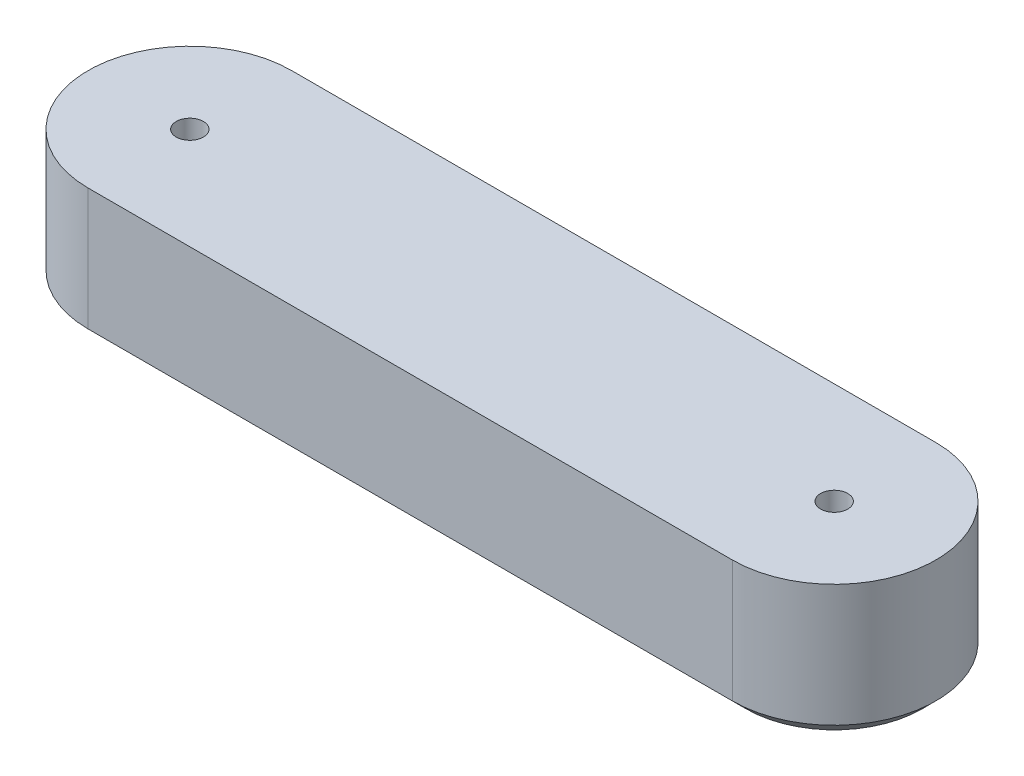
ISO-10303-21;
HEADER;
FILE_DESCRIPTION(('STEP AP214'),'2;1');
FILE_NAME('part.step','',(''),(''),'','','');
FILE_SCHEMA(('AUTOMOTIVE_DESIGN { 1 0 10303 214 1 1 1 1 }'));
ENDSEC;
DATA;
#1=APPLICATION_CONTEXT('core data for automotive mechanical design processes');
#2=APPLICATION_PROTOCOL_DEFINITION('international standard','automotive_design',2000,#1);
#3=PRODUCT_CONTEXT('',#1,'mechanical');
#4=PRODUCT('Part','Part','',(#3));
#5=PRODUCT_RELATED_PRODUCT_CATEGORY('part','',(#4));
#6=PRODUCT_DEFINITION_FORMATION('','',#4);
#7=PRODUCT_DEFINITION_CONTEXT('part definition',#1,'design');
#8=PRODUCT_DEFINITION('design','',#6,#7);
#9=PRODUCT_DEFINITION_SHAPE('','',#8);
#10=(LENGTH_UNIT() NAMED_UNIT(*) SI_UNIT(.MILLI.,.METRE.));
#11=(NAMED_UNIT(*) PLANE_ANGLE_UNIT() SI_UNIT($,.RADIAN.));
#12=(NAMED_UNIT(*) SI_UNIT($,.STERADIAN.) SOLID_ANGLE_UNIT());
#13=UNCERTAINTY_MEASURE_WITH_UNIT(LENGTH_MEASURE(1.E-05),#10,'distance_accuracy_value','');
#14=(GEOMETRIC_REPRESENTATION_CONTEXT(3) GLOBAL_UNCERTAINTY_ASSIGNED_CONTEXT((#13)) GLOBAL_UNIT_ASSIGNED_CONTEXT((#10,
#11,#12)) REPRESENTATION_CONTEXT('',''));
#15=CARTESIAN_POINT('',(0.,0.,0.));
#16=DIRECTION('',(0.,0.,1.));
#17=DIRECTION('',(1.,0.,0.));
#18=AXIS2_PLACEMENT_3D('',#15,#16,#17);
#19=CARTESIAN_POINT('',(0.,20.,0.));
#20=DIRECTION('',(0.,-1.,0.));
#21=DIRECTION('',(0.,0.,-1.));
#22=AXIS2_PLACEMENT_3D('',#19,#20,#21);
#23=CYLINDRICAL_SURFACE('',#22,15.);
#24=DIRECTION('',(0.,-1.,0.));
#25=VECTOR('',#24,1.);
#26=CARTESIAN_POINT('',(0.,20.,-15.));
#27=LINE('',#26,#25);
#28=CARTESIAN_POINT('',(0.,20.,-15.));
#29=VERTEX_POINT('',#28);
#30=CARTESIAN_POINT('',(0.,2.,-15.));
#31=VERTEX_POINT('',#30);
#32=EDGE_CURVE('E158',#29,#31,#27,.T.);
#33=ORIENTED_EDGE('',*,*,#32,.T.);
#34=CARTESIAN_POINT('',(0.,2.,0.));
#35=DIRECTION('',(0.,1.,0.));
#36=DIRECTION('',(0.,0.,1.));
#37=AXIS2_PLACEMENT_3D('',#34,#35,#36);
#38=CIRCLE('',#37,15.);
#39=CARTESIAN_POINT('',(0.,2.,15.));
#40=VERTEX_POINT('',#39);
#41=EDGE_CURVE('E47',#31,#40,#38,.T.);
#42=ORIENTED_EDGE('',*,*,#41,.T.);
#43=DIRECTION('',(0.,-1.,0.));
#44=VECTOR('',#43,1.);
#45=CARTESIAN_POINT('',(0.,20.,15.));
#46=LINE('',#45,#44);
#47=CARTESIAN_POINT('',(0.,20.,15.));
#48=VERTEX_POINT('',#47);
#49=EDGE_CURVE('E99',#48,#40,#46,.T.);
#50=ORIENTED_EDGE('',*,*,#49,.F.);
#51=CARTESIAN_POINT('',(0.,20.,0.));
#52=DIRECTION('',(0.,1.,0.));
#53=DIRECTION('',(0.,0.,1.));
#54=AXIS2_PLACEMENT_3D('',#51,#52,#53);
#55=CIRCLE('',#54,15.);
#56=EDGE_CURVE('E105',#29,#48,#55,.T.);
#57=ORIENTED_EDGE('',*,*,#56,.F.);
#58=EDGE_LOOP('',(#33,#42,#50,#57));
#59=FACE_BOUND('',#58,.T.);
#60=ADVANCED_FACE('F37',(#59),#23,.T.);
#61=CARTESIAN_POINT('',(0.,20.,15.));
#62=DIRECTION('',(0.,0.,-1.));
#63=DIRECTION('',(-1.,0.,0.));
#64=AXIS2_PLACEMENT_3D('',#61,#62,#63);
#65=PLANE('',#64);
#66=ORIENTED_EDGE('',*,*,#49,.T.);
#67=DIRECTION('',(1.,0.,0.));
#68=VECTOR('',#67,1.);
#69=CARTESIAN_POINT('',(0.,2.,15.));
#70=LINE('',#69,#68);
#71=CARTESIAN_POINT('',(95.,2.,15.));
#72=VERTEX_POINT('',#71);
#73=EDGE_CURVE('E115',#40,#72,#70,.T.);
#74=ORIENTED_EDGE('',*,*,#73,.T.);
#75=DIRECTION('',(0.,-1.,0.));
#76=VECTOR('',#75,1.);
#77=CARTESIAN_POINT('',(95.,20.,15.));
#78=LINE('',#77,#76);
#79=CARTESIAN_POINT('',(95.,20.,15.));
#80=VERTEX_POINT('',#79);
#81=EDGE_CURVE('E101',#80,#72,#78,.T.);
#82=ORIENTED_EDGE('',*,*,#81,.F.);
#83=DIRECTION('',(1.,0.,0.));
#84=VECTOR('',#83,1.);
#85=CARTESIAN_POINT('',(0.,20.,15.));
#86=LINE('',#85,#84);
#87=EDGE_CURVE('E94',#48,#80,#86,.T.);
#88=ORIENTED_EDGE('',*,*,#87,.F.);
#89=EDGE_LOOP('',(#66,#74,#82,#88));
#90=FACE_BOUND('',#89,.T.);
#91=ADVANCED_FACE('F96',(#90),#65,.F.);
#92=CARTESIAN_POINT('',(95.,20.,0.));
#93=DIRECTION('',(0.,-1.,0.));
#94=DIRECTION('',(0.,0.,-1.));
#95=AXIS2_PLACEMENT_3D('',#92,#93,#94);
#96=CYLINDRICAL_SURFACE('',#95,15.);
#97=ORIENTED_EDGE('',*,*,#81,.T.);
#98=CARTESIAN_POINT('',(95.,2.,0.));
#99=DIRECTION('',(0.,1.,0.));
#100=DIRECTION('',(0.,0.,1.));
#101=AXIS2_PLACEMENT_3D('',#98,#99,#100);
#102=CIRCLE('',#101,15.);
#103=CARTESIAN_POINT('',(95.,2.,-15.));
#104=VERTEX_POINT('',#103);
#105=EDGE_CURVE('E61',#72,#104,#102,.T.);
#106=ORIENTED_EDGE('',*,*,#105,.T.);
#107=DIRECTION('',(0.,-1.,0.));
#108=VECTOR('',#107,1.);
#109=CARTESIAN_POINT('',(95.,20.,-15.));
#110=LINE('',#109,#108);
#111=CARTESIAN_POINT('',(95.,20.,-15.));
#112=VERTEX_POINT('',#111);
#113=EDGE_CURVE('E119',#112,#104,#110,.T.);
#114=ORIENTED_EDGE('',*,*,#113,.F.);
#115=CARTESIAN_POINT('',(95.,20.,0.));
#116=DIRECTION('',(0.,1.,0.));
#117=DIRECTION('',(0.,0.,1.));
#118=AXIS2_PLACEMENT_3D('',#115,#116,#117);
#119=CIRCLE('',#118,15.);
#120=EDGE_CURVE('E104',#80,#112,#119,.T.);
#121=ORIENTED_EDGE('',*,*,#120,.F.);
#122=EDGE_LOOP('',(#97,#106,#114,#121));
#123=FACE_BOUND('',#122,.T.);
#124=ADVANCED_FACE('F168',(#123),#96,.T.);
#125=CARTESIAN_POINT('',(0.,20.,-15.));
#126=DIRECTION('',(0.,0.,1.));
#127=DIRECTION('',(1.,0.,0.));
#128=AXIS2_PLACEMENT_3D('',#125,#126,#127);
#129=PLANE('',#128);
#130=ORIENTED_EDGE('',*,*,#113,.T.);
#131=DIRECTION('',(-1.,0.,0.));
#132=VECTOR('',#131,1.);
#133=CARTESIAN_POINT('',(0.,2.,-15.));
#134=LINE('',#133,#132);
#135=EDGE_CURVE('E11',#104,#31,#134,.T.);
#136=ORIENTED_EDGE('',*,*,#135,.T.);
#137=ORIENTED_EDGE('',*,*,#32,.F.);
#138=DIRECTION('',(-1.,0.,0.));
#139=VECTOR('',#138,1.);
#140=CARTESIAN_POINT('',(0.,20.,-15.));
#141=LINE('',#140,#139);
#142=EDGE_CURVE('E110',#112,#29,#141,.T.);
#143=ORIENTED_EDGE('',*,*,#142,.F.);
#144=EDGE_LOOP('',(#130,#136,#137,#143));
#145=FACE_BOUND('',#144,.T.);
#146=ADVANCED_FACE('F159',(#145),#129,.F.);
#147=CARTESIAN_POINT('',(0.,20.,0.));
#148=DIRECTION('',(0.,1.,0.));
#149=DIRECTION('',(0.,0.,1.));
#150=AXIS2_PLACEMENT_3D('',#147,#148,#149);
#151=PLANE('',#150);
#152=CARTESIAN_POINT('',(0.,20.,0.));
#153=DIRECTION('',(0.,1.,0.));
#154=DIRECTION('',(0.,0.,1.));
#155=AXIS2_PLACEMENT_3D('',#152,#153,#154);
#156=CIRCLE('',#155,2.);
#157=CARTESIAN_POINT('',(0.,20.,2.));
#158=VERTEX_POINT('',#157);
#159=EDGE_CURVE('E152',#158,#158,#156,.T.);
#160=ORIENTED_EDGE('',*,*,#159,.F.);
#161=EDGE_LOOP('',(#160));
#162=FACE_BOUND('',#161,.T.);
#163=CARTESIAN_POINT('',(95.,20.,0.));
#164=DIRECTION('',(0.,1.,0.));
#165=DIRECTION('',(0.,0.,1.));
#166=AXIS2_PLACEMENT_3D('',#163,#164,#165);
#167=CIRCLE('',#166,2.);
#168=CARTESIAN_POINT('',(95.,20.,2.));
#169=VERTEX_POINT('',#168);
#170=EDGE_CURVE('E142',#169,#169,#167,.T.);
#171=ORIENTED_EDGE('',*,*,#170,.F.);
#172=EDGE_LOOP('',(#171));
#173=FACE_BOUND('',#172,.T.);
#174=ORIENTED_EDGE('',*,*,#56,.T.);
#175=ORIENTED_EDGE('',*,*,#87,.T.);
#176=ORIENTED_EDGE('',*,*,#120,.T.);
#177=ORIENTED_EDGE('',*,*,#142,.T.);
#178=EDGE_LOOP('',(#174,#175,#176,#177));
#179=FACE_BOUND('',#178,.T.);
#180=ADVANCED_FACE('F108',(#162,#173,#179),#151,.T.);
#181=CARTESIAN_POINT('',(0.,0.,0.));
#182=DIRECTION('',(0.,1.,0.));
#183=DIRECTION('',(0.,0.,1.));
#184=AXIS2_PLACEMENT_3D('',#181,#182,#183);
#185=PLANE('',#184);
#186=CARTESIAN_POINT('',(95.,0.,0.));
#187=DIRECTION('',(0.,1.,0.));
#188=DIRECTION('',(0.,0.,1.));
#189=AXIS2_PLACEMENT_3D('',#186,#187,#188);
#190=CIRCLE('',#189,13.);
#191=CARTESIAN_POINT('',(95.,0.,-13.));
#192=VERTEX_POINT('',#191);
#193=CARTESIAN_POINT('',(95.,0.,13.));
#194=VERTEX_POINT('',#193);
#195=EDGE_CURVE('E126',#192,#194,#190,.F.);
#196=ORIENTED_EDGE('',*,*,#195,.T.);
#197=DIRECTION('',(-1.,0.,0.));
#198=VECTOR('',#197,1.);
#199=CARTESIAN_POINT('',(0.,0.,13.));
#200=LINE('',#199,#198);
#201=CARTESIAN_POINT('',(0.,0.,13.));
#202=VERTEX_POINT('',#201);
#203=EDGE_CURVE('E128',#194,#202,#200,.T.);
#204=ORIENTED_EDGE('',*,*,#203,.T.);
#205=CARTESIAN_POINT('',(0.,0.,0.));
#206=DIRECTION('',(0.,1.,0.));
#207=DIRECTION('',(0.,0.,1.));
#208=AXIS2_PLACEMENT_3D('',#205,#206,#207);
#209=CIRCLE('',#208,13.);
#210=CARTESIAN_POINT('',(0.,0.,-13.));
#211=VERTEX_POINT('',#210);
#212=EDGE_CURVE('E124',#202,#211,#209,.F.);
#213=ORIENTED_EDGE('',*,*,#212,.T.);
#214=DIRECTION('',(1.,0.,0.));
#215=VECTOR('',#214,1.);
#216=CARTESIAN_POINT('',(0.,0.,-13.));
#217=LINE('',#216,#215);
#218=EDGE_CURVE('E117',#211,#192,#217,.T.);
#219=ORIENTED_EDGE('',*,*,#218,.T.);
#220=EDGE_LOOP('',(#196,#204,#213,#219));
#221=FACE_BOUND('',#220,.T.);
#222=ADVANCED_FACE('F220',(#221),#185,.F.);
#223=CARTESIAN_POINT('',(95.,17.,0.));
#224=DIRECTION('',(0.,1.,0.));
#225=DIRECTION('',(0.,0.,1.));
#226=AXIS2_PLACEMENT_3D('',#223,#224,#225);
#227=CYLINDRICAL_SURFACE('',#226,2.);
#228=CARTESIAN_POINT('',(95.,17.,0.));
#229=DIRECTION('',(0.,1.,0.));
#230=DIRECTION('',(0.,0.,1.));
#231=AXIS2_PLACEMENT_3D('',#228,#229,#230);
#232=CIRCLE('',#231,2.);
#233=CARTESIAN_POINT('',(95.,17.,2.));
#234=VERTEX_POINT('',#233);
#235=EDGE_CURVE('E147',#234,#234,#232,.T.);
#236=ORIENTED_EDGE('',*,*,#235,.F.);
#237=EDGE_LOOP('',(#236));
#238=FACE_BOUND('',#237,.T.);
#239=ORIENTED_EDGE('',*,*,#170,.T.);
#240=EDGE_LOOP('',(#239));
#241=FACE_BOUND('',#240,.T.);
#242=ADVANCED_FACE('F216',(#238,#241),#227,.F.);
#243=CARTESIAN_POINT('',(95.,17.,0.));
#244=DIRECTION('',(0.,1.,0.));
#245=DIRECTION('',(0.,0.,1.));
#246=AXIS2_PLACEMENT_3D('',#243,#244,#245);
#247=PLANE('',#246);
#248=ORIENTED_EDGE('',*,*,#235,.T.);
#249=EDGE_LOOP('',(#248));
#250=FACE_BOUND('',#249,.T.);
#251=ADVANCED_FACE('F209',(#250),#247,.T.);
#252=CARTESIAN_POINT('',(0.,17.,0.));
#253=DIRECTION('',(0.,1.,0.));
#254=DIRECTION('',(0.,0.,1.));
#255=AXIS2_PLACEMENT_3D('',#252,#253,#254);
#256=CYLINDRICAL_SURFACE('',#255,2.);
#257=CARTESIAN_POINT('',(0.,17.,0.));
#258=DIRECTION('',(0.,1.,0.));
#259=DIRECTION('',(0.,0.,1.));
#260=AXIS2_PLACEMENT_3D('',#257,#258,#259);
#261=CIRCLE('',#260,2.);
#262=CARTESIAN_POINT('',(0.,17.,2.));
#263=VERTEX_POINT('',#262);
#264=EDGE_CURVE('E112',#263,#263,#261,.T.);
#265=ORIENTED_EDGE('',*,*,#264,.F.);
#266=EDGE_LOOP('',(#265));
#267=FACE_BOUND('',#266,.T.);
#268=ORIENTED_EDGE('',*,*,#159,.T.);
#269=EDGE_LOOP('',(#268));
#270=FACE_BOUND('',#269,.T.);
#271=ADVANCED_FACE('F204',(#267,#270),#256,.F.);
#272=CARTESIAN_POINT('',(0.,17.,0.));
#273=DIRECTION('',(0.,1.,0.));
#274=DIRECTION('',(0.,0.,1.));
#275=AXIS2_PLACEMENT_3D('',#272,#273,#274);
#276=PLANE('',#275);
#277=ORIENTED_EDGE('',*,*,#264,.T.);
#278=EDGE_LOOP('',(#277));
#279=FACE_BOUND('',#278,.T.);
#280=ADVANCED_FACE('F200',(#279),#276,.T.);
#281=CARTESIAN_POINT('',(0.,2.,-15.));
#282=DIRECTION('',(0.,0.70710678118655,0.707106781186545));
#283=DIRECTION('',(-1.,0.,0.));
#284=AXIS2_PLACEMENT_3D('',#281,#282,#283);
#285=PLANE('',#284);
#286=DIRECTION('',(0.,0.707106781186545,-0.70710678118655));
#287=VECTOR('',#286,1.);
#288=CARTESIAN_POINT('',(95.,0.,-13.));
#289=LINE('',#288,#287);
#290=EDGE_CURVE('E136',#192,#104,#289,.T.);
#291=ORIENTED_EDGE('',*,*,#290,.F.);
#292=ORIENTED_EDGE('',*,*,#218,.F.);
#293=DIRECTION('',(0.,-0.707106781186545,0.70710678118655));
#294=VECTOR('',#293,1.);
#295=CARTESIAN_POINT('',(0.,2.,-15.));
#296=LINE('',#295,#294);
#297=EDGE_CURVE('E42',#31,#211,#296,.T.);
#298=ORIENTED_EDGE('',*,*,#297,.F.);
#299=ORIENTED_EDGE('',*,*,#135,.F.);
#300=EDGE_LOOP('',(#291,#292,#298,#299));
#301=FACE_BOUND('',#300,.T.);
#302=ADVANCED_FACE('F40',(#301),#285,.F.);
#303=CARTESIAN_POINT('',(0.,2.,0.));
#304=DIRECTION('',(0.,1.,0.));
#305=DIRECTION('',(0.,0.,1.));
#306=AXIS2_PLACEMENT_3D('',#303,#304,#305);
#307=CONICAL_SURFACE('',#306,15.,0.785398163397452);
#308=ORIENTED_EDGE('',*,*,#297,.T.);
#309=ORIENTED_EDGE('',*,*,#212,.F.);
#310=DIRECTION('',(0.,-0.707106781186545,-0.70710678118655));
#311=VECTOR('',#310,1.);
#312=CARTESIAN_POINT('',(0.,2.,15.));
#313=LINE('',#312,#311);
#314=EDGE_CURVE('E135',#40,#202,#313,.T.);
#315=ORIENTED_EDGE('',*,*,#314,.F.);
#316=ORIENTED_EDGE('',*,*,#41,.F.);
#317=EDGE_LOOP('',(#308,#309,#315,#316));
#318=FACE_BOUND('',#317,.T.);
#319=ADVANCED_FACE('F162',(#318),#307,.T.);
#320=CARTESIAN_POINT('',(95.,2.,0.));
#321=DIRECTION('',(0.,1.,0.));
#322=DIRECTION('',(0.,0.,1.));
#323=AXIS2_PLACEMENT_3D('',#320,#321,#322);
#324=CONICAL_SURFACE('',#323,15.,0.785398163397452);
#325=ORIENTED_EDGE('',*,*,#290,.T.);
#326=ORIENTED_EDGE('',*,*,#105,.F.);
#327=DIRECTION('',(0.,0.707106781186545,0.70710678118655));
#328=VECTOR('',#327,1.);
#329=CARTESIAN_POINT('',(95.,0.,13.));
#330=LINE('',#329,#328);
#331=EDGE_CURVE('E133',#194,#72,#330,.T.);
#332=ORIENTED_EDGE('',*,*,#331,.F.);
#333=ORIENTED_EDGE('',*,*,#195,.F.);
#334=EDGE_LOOP('',(#325,#326,#332,#333));
#335=FACE_BOUND('',#334,.T.);
#336=ADVANCED_FACE('F189',(#335),#324,.T.);
#337=CARTESIAN_POINT('',(0.,2.,15.));
#338=DIRECTION('',(0.,0.70710678118655,-0.707106781186545));
#339=DIRECTION('',(1.,0.,0.));
#340=AXIS2_PLACEMENT_3D('',#337,#338,#339);
#341=PLANE('',#340);
#342=ORIENTED_EDGE('',*,*,#314,.T.);
#343=ORIENTED_EDGE('',*,*,#203,.F.);
#344=ORIENTED_EDGE('',*,*,#331,.T.);
#345=ORIENTED_EDGE('',*,*,#73,.F.);
#346=EDGE_LOOP('',(#342,#343,#344,#345));
#347=FACE_BOUND('',#346,.T.);
#348=ADVANCED_FACE('F166',(#347),#341,.F.);
#349=CLOSED_SHELL('',(#60,#91,#124,#146,#180,#222,#242,#251,#271,#280,#302,#319,#336,#348));
#350=MANIFOLD_SOLID_BREP('B2',#349);
#351=ADVANCED_BREP_SHAPE_REPRESENTATION('',(#18,#350),#14);
#352=SHAPE_DEFINITION_REPRESENTATION(#9,#351);
ENDSEC;
END-ISO-10303-21;
